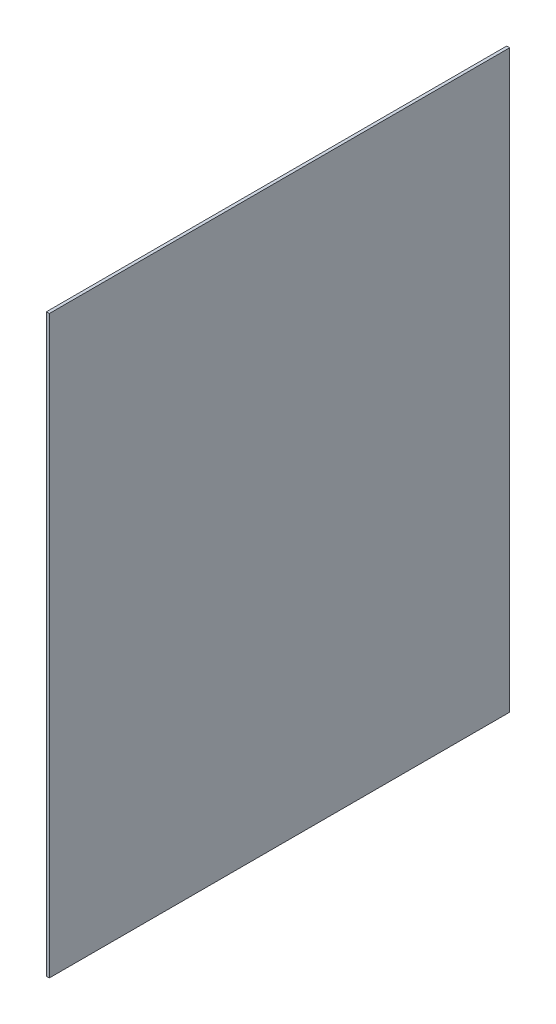
ISO-10303-21;
HEADER;
FILE_DESCRIPTION(('STEP AP214'),'2;1');
FILE_NAME('part.step','',(''),(''),'','','');
FILE_SCHEMA(('AUTOMOTIVE_DESIGN { 1 0 10303 214 1 1 1 1 }'));
ENDSEC;
DATA;
#1=APPLICATION_CONTEXT('core data for automotive mechanical design processes');
#2=APPLICATION_PROTOCOL_DEFINITION('international standard','automotive_design',2000,#1);
#3=PRODUCT_CONTEXT('',#1,'mechanical');
#4=PRODUCT('Part','Part','',(#3));
#5=PRODUCT_RELATED_PRODUCT_CATEGORY('part','',(#4));
#6=PRODUCT_DEFINITION_FORMATION('','',#4);
#7=PRODUCT_DEFINITION_CONTEXT('part definition',#1,'design');
#8=PRODUCT_DEFINITION('design','',#6,#7);
#9=PRODUCT_DEFINITION_SHAPE('','',#8);
#10=(LENGTH_UNIT() NAMED_UNIT(*) SI_UNIT(.MILLI.,.METRE.));
#11=(NAMED_UNIT(*) PLANE_ANGLE_UNIT() SI_UNIT($,.RADIAN.));
#12=(NAMED_UNIT(*) SI_UNIT($,.STERADIAN.) SOLID_ANGLE_UNIT());
#13=UNCERTAINTY_MEASURE_WITH_UNIT(LENGTH_MEASURE(1.E-05),#10,'distance_accuracy_value','');
#14=(GEOMETRIC_REPRESENTATION_CONTEXT(3) GLOBAL_UNCERTAINTY_ASSIGNED_CONTEXT((#13)) GLOBAL_UNIT_ASSIGNED_CONTEXT((#10,
#11,#12)) REPRESENTATION_CONTEXT('',''));
#15=CARTESIAN_POINT('',(0.,0.,0.));
#16=DIRECTION('',(0.,0.,1.));
#17=DIRECTION('',(1.,0.,0.));
#18=AXIS2_PLACEMENT_3D('',#15,#16,#17);
#19=CARTESIAN_POINT('',(0.,0.,-3.84));
#20=DIRECTION('',(0.,0.,1.));
#21=DIRECTION('',(1.,0.,0.));
#22=AXIS2_PLACEMENT_3D('',#19,#20,#21);
#23=PLANE('',#22);
#24=DIRECTION('',(0.,1.,0.));
#25=VECTOR('',#24,1.);
#26=CARTESIAN_POINT('',(-0.025,0.,-3.84));
#27=LINE('',#26,#25);
#28=CARTESIAN_POINT('',(-0.025,-4.8,-3.84));
#29=VERTEX_POINT('',#28);
#30=CARTESIAN_POINT('',(-0.025,4.8,-3.84));
#31=VERTEX_POINT('',#30);
#32=EDGE_CURVE('E80',#29,#31,#27,.T.);
#33=ORIENTED_EDGE('',*,*,#32,.T.);
#34=DIRECTION('',(1.,0.,0.));
#35=VECTOR('',#34,1.);
#36=CARTESIAN_POINT('',(0.,4.8,-3.84));
#37=LINE('',#36,#35);
#38=CARTESIAN_POINT('',(0.025,4.8,-3.84));
#39=VERTEX_POINT('',#38);
#40=EDGE_CURVE('E55',#31,#39,#37,.T.);
#41=ORIENTED_EDGE('',*,*,#40,.T.);
#42=DIRECTION('',(0.,1.,0.));
#43=VECTOR('',#42,1.);
#44=CARTESIAN_POINT('',(0.025,0.,-3.84));
#45=LINE('',#44,#43);
#46=CARTESIAN_POINT('',(0.025,-4.8,-3.84));
#47=VERTEX_POINT('',#46);
#48=EDGE_CURVE('E78',#39,#47,#45,.F.);
#49=ORIENTED_EDGE('',*,*,#48,.T.);
#50=DIRECTION('',(1.,0.,0.));
#51=VECTOR('',#50,1.);
#52=CARTESIAN_POINT('',(0.,-4.8,-3.84));
#53=LINE('',#52,#51);
#54=EDGE_CURVE('E20',#29,#47,#53,.T.);
#55=ORIENTED_EDGE('',*,*,#54,.F.);
#56=EDGE_LOOP('',(#33,#41,#49,#55));
#57=FACE_BOUND('',#56,.T.);
#58=ADVANCED_FACE('F17',(#57),#23,.F.);
#59=CARTESIAN_POINT('',(0.,4.8,0.));
#60=DIRECTION('',(0.,1.,0.));
#61=DIRECTION('',(0.,0.,1.));
#62=AXIS2_PLACEMENT_3D('',#59,#60,#61);
#63=PLANE('',#62);
#64=DIRECTION('',(0.,0.,-1.));
#65=VECTOR('',#64,1.);
#66=CARTESIAN_POINT('',(-0.025,4.8,0.));
#67=LINE('',#66,#65);
#68=CARTESIAN_POINT('',(-0.025,4.8,3.84));
#69=VERTEX_POINT('',#68);
#70=EDGE_CURVE('E67',#31,#69,#67,.F.);
#71=ORIENTED_EDGE('',*,*,#70,.T.);
#72=DIRECTION('',(-1.,0.,0.));
#73=VECTOR('',#72,1.);
#74=CARTESIAN_POINT('',(0.,4.8,3.84));
#75=LINE('',#74,#73);
#76=CARTESIAN_POINT('',(0.025,4.8,3.84));
#77=VERTEX_POINT('',#76);
#78=EDGE_CURVE('E60',#69,#77,#75,.F.);
#79=ORIENTED_EDGE('',*,*,#78,.T.);
#80=DIRECTION('',(0.,0.,-1.));
#81=VECTOR('',#80,1.);
#82=CARTESIAN_POINT('',(0.025,4.8,0.));
#83=LINE('',#82,#81);
#84=EDGE_CURVE('E64',#77,#39,#83,.T.);
#85=ORIENTED_EDGE('',*,*,#84,.T.);
#86=ORIENTED_EDGE('',*,*,#40,.F.);
#87=EDGE_LOOP('',(#71,#79,#85,#86));
#88=FACE_BOUND('',#87,.T.);
#89=ADVANCED_FACE('F62',(#88),#63,.T.);
#90=CARTESIAN_POINT('',(0.,0.,3.84));
#91=DIRECTION('',(0.,0.,-1.));
#92=DIRECTION('',(-1.,0.,0.));
#93=AXIS2_PLACEMENT_3D('',#90,#91,#92);
#94=PLANE('',#93);
#95=DIRECTION('',(0.,1.,0.));
#96=VECTOR('',#95,1.);
#97=CARTESIAN_POINT('',(-0.025,0.,3.84));
#98=LINE('',#97,#96);
#99=CARTESIAN_POINT('',(-0.025,-4.8,3.84));
#100=VERTEX_POINT('',#99);
#101=EDGE_CURVE('E86',#69,#100,#98,.F.);
#102=ORIENTED_EDGE('',*,*,#101,.T.);
#103=DIRECTION('',(-1.,0.,0.));
#104=VECTOR('',#103,1.);
#105=CARTESIAN_POINT('',(0.,-4.8,3.84));
#106=LINE('',#105,#104);
#107=CARTESIAN_POINT('',(0.025,-4.8,3.84));
#108=VERTEX_POINT('',#107);
#109=EDGE_CURVE('E35',#108,#100,#106,.T.);
#110=ORIENTED_EDGE('',*,*,#109,.F.);
#111=DIRECTION('',(0.,1.,0.));
#112=VECTOR('',#111,1.);
#113=CARTESIAN_POINT('',(0.025,0.,3.84));
#114=LINE('',#113,#112);
#115=EDGE_CURVE('E70',#108,#77,#114,.T.);
#116=ORIENTED_EDGE('',*,*,#115,.T.);
#117=ORIENTED_EDGE('',*,*,#78,.F.);
#118=EDGE_LOOP('',(#102,#110,#116,#117));
#119=FACE_BOUND('',#118,.T.);
#120=ADVANCED_FACE('F73',(#119),#94,.F.);
#121=CARTESIAN_POINT('',(0.025,0.,0.));
#122=DIRECTION('',(1.,0.,0.));
#123=DIRECTION('',(0.,0.,-1.));
#124=AXIS2_PLACEMENT_3D('',#121,#122,#123);
#125=PLANE('',#124);
#126=ORIENTED_EDGE('',*,*,#48,.F.);
#127=ORIENTED_EDGE('',*,*,#84,.F.);
#128=ORIENTED_EDGE('',*,*,#115,.F.);
#129=DIRECTION('',(0.,0.,-1.));
#130=VECTOR('',#129,1.);
#131=CARTESIAN_POINT('',(0.025,-4.8,0.));
#132=LINE('',#131,#130);
#133=EDGE_CURVE('E26',#108,#47,#132,.T.);
#134=ORIENTED_EDGE('',*,*,#133,.T.);
#135=EDGE_LOOP('',(#126,#127,#128,#134));
#136=FACE_BOUND('',#135,.T.);
#137=ADVANCED_FACE('F77',(#136),#125,.T.);
#138=CARTESIAN_POINT('',(-0.025,0.,0.));
#139=DIRECTION('',(1.,0.,0.));
#140=DIRECTION('',(0.,0.,-1.));
#141=AXIS2_PLACEMENT_3D('',#138,#139,#140);
#142=PLANE('',#141);
#143=ORIENTED_EDGE('',*,*,#70,.F.);
#144=ORIENTED_EDGE('',*,*,#32,.F.);
#145=DIRECTION('',(0.,0.,-1.));
#146=VECTOR('',#145,1.);
#147=CARTESIAN_POINT('',(-0.025,-4.8,0.));
#148=LINE('',#147,#146);
#149=EDGE_CURVE('E11',#29,#100,#148,.F.);
#150=ORIENTED_EDGE('',*,*,#149,.T.);
#151=ORIENTED_EDGE('',*,*,#101,.F.);
#152=EDGE_LOOP('',(#143,#144,#150,#151));
#153=FACE_BOUND('',#152,.T.);
#154=ADVANCED_FACE('F91',(#153),#142,.F.);
#155=CARTESIAN_POINT('',(0.,-4.8,0.));
#156=DIRECTION('',(0.,-1.,0.));
#157=DIRECTION('',(0.,0.,-1.));
#158=AXIS2_PLACEMENT_3D('',#155,#156,#157);
#159=PLANE('',#158);
#160=ORIENTED_EDGE('',*,*,#149,.F.);
#161=ORIENTED_EDGE('',*,*,#54,.T.);
#162=ORIENTED_EDGE('',*,*,#133,.F.);
#163=ORIENTED_EDGE('',*,*,#109,.T.);
#164=EDGE_LOOP('',(#160,#161,#162,#163));
#165=FACE_BOUND('',#164,.T.);
#166=ADVANCED_FACE('F84',(#165),#159,.T.);
#167=CLOSED_SHELL('',(#58,#89,#120,#137,#154,#166));
#168=MANIFOLD_SOLID_BREP('B1',#167);
#169=ADVANCED_BREP_SHAPE_REPRESENTATION('',(#18,#168),#14);
#170=SHAPE_DEFINITION_REPRESENTATION(#9,#169);
ENDSEC;
END-ISO-10303-21;
